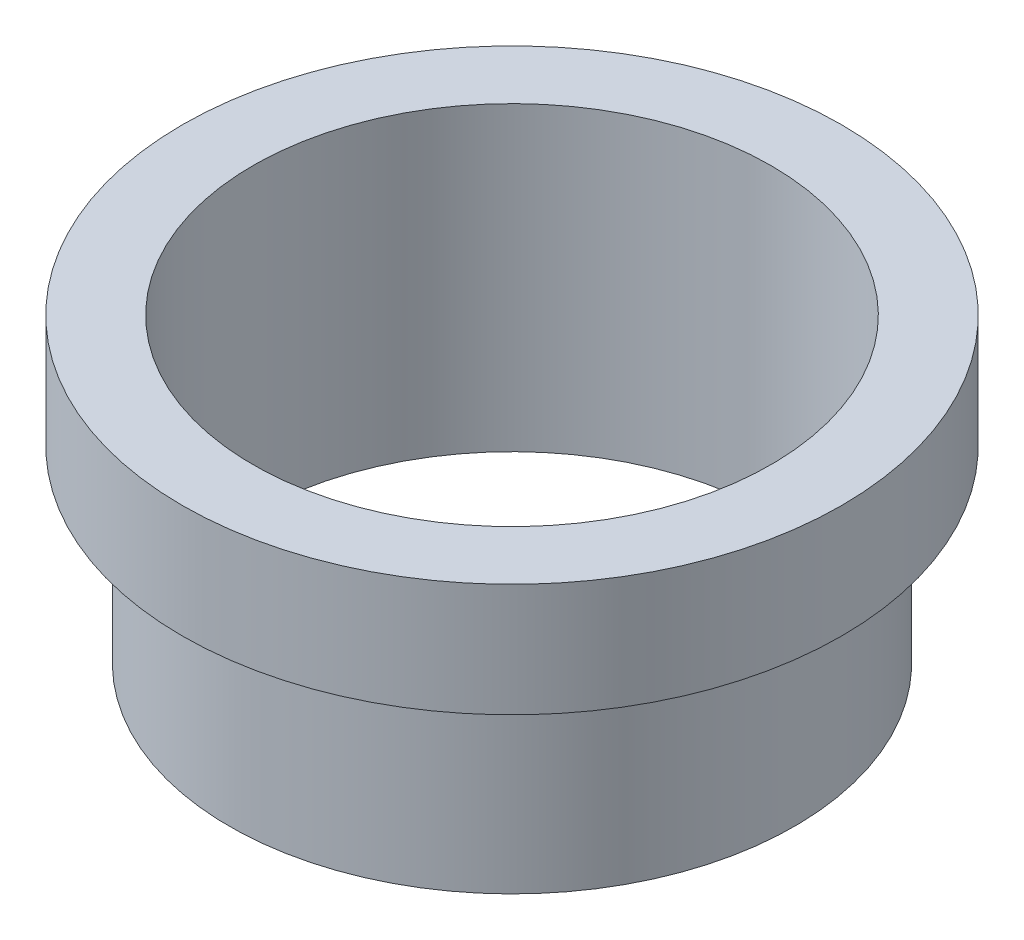
ISO-10303-21;
HEADER;
FILE_DESCRIPTION(('STEP AP214'),'2;1');
FILE_NAME('part.step','',(''),(''),'','','');
FILE_SCHEMA(('AUTOMOTIVE_DESIGN { 1 0 10303 214 1 1 1 1 }'));
ENDSEC;
DATA;
#1=APPLICATION_CONTEXT('core data for automotive mechanical design processes');
#2=APPLICATION_PROTOCOL_DEFINITION('international standard','automotive_design',2000,#1);
#3=PRODUCT_CONTEXT('',#1,'mechanical');
#4=PRODUCT('Part','Part','',(#3));
#5=PRODUCT_RELATED_PRODUCT_CATEGORY('part','',(#4));
#6=PRODUCT_DEFINITION_FORMATION('','',#4);
#7=PRODUCT_DEFINITION_CONTEXT('part definition',#1,'design');
#8=PRODUCT_DEFINITION('design','',#6,#7);
#9=PRODUCT_DEFINITION_SHAPE('','',#8);
#10=(LENGTH_UNIT() NAMED_UNIT(*) SI_UNIT(.MILLI.,.METRE.));
#11=(NAMED_UNIT(*) PLANE_ANGLE_UNIT() SI_UNIT($,.RADIAN.));
#12=(NAMED_UNIT(*) SI_UNIT($,.STERADIAN.) SOLID_ANGLE_UNIT());
#13=UNCERTAINTY_MEASURE_WITH_UNIT(LENGTH_MEASURE(1.E-05),#10,'distance_accuracy_value','');
#14=(GEOMETRIC_REPRESENTATION_CONTEXT(3) GLOBAL_UNCERTAINTY_ASSIGNED_CONTEXT((#13)) GLOBAL_UNIT_ASSIGNED_CONTEXT((#10,
#11,#12)) REPRESENTATION_CONTEXT('',''));
#15=CARTESIAN_POINT('',(0.,0.,0.));
#16=DIRECTION('',(0.,0.,1.));
#17=DIRECTION('',(1.,0.,0.));
#18=AXIS2_PLACEMENT_3D('',#15,#16,#17);
#19=CARTESIAN_POINT('',(-22.225,0.,0.));
#20=DIRECTION('',(0.,-1.,0.));
#21=DIRECTION('',(0.,0.,-1.));
#22=AXIS2_PLACEMENT_3D('',#19,#20,#21);
#23=PLANE('',#22);
#24=CARTESIAN_POINT('',(0.,0.,0.));
#25=DIRECTION('',(0.,-1.,0.));
#26=DIRECTION('',(0.,0.,-1.));
#27=AXIS2_PLACEMENT_3D('',#24,#25,#26);
#28=CIRCLE('',#27,22.225);
#29=CARTESIAN_POINT('',(0.,0.,-22.225));
#30=VERTEX_POINT('',#29);
#31=EDGE_CURVE('E70',#30,#30,#28,.T.);
#32=ORIENTED_EDGE('',*,*,#31,.F.);
#33=EDGE_LOOP('',(#32));
#34=FACE_BOUND('',#33,.T.);
#35=CARTESIAN_POINT('',(0.,0.,0.));
#36=DIRECTION('',(0.,-1.,0.));
#37=DIRECTION('',(0.,0.,-1.));
#38=AXIS2_PLACEMENT_3D('',#35,#36,#37);
#39=CIRCLE('',#38,17.4625);
#40=CARTESIAN_POINT('',(0.,0.,-17.4625));
#41=VERTEX_POINT('',#40);
#42=EDGE_CURVE('E10',#41,#41,#39,.T.);
#43=ORIENTED_EDGE('',*,*,#42,.T.);
#44=EDGE_LOOP('',(#43));
#45=FACE_BOUND('',#44,.T.);
#46=ADVANCED_FACE('F43',(#34,#45),#23,.F.);
#47=CARTESIAN_POINT('',(0.,0.,0.));
#48=DIRECTION('',(0.,-1.,0.));
#49=DIRECTION('',(0.,0.,-1.));
#50=AXIS2_PLACEMENT_3D('',#47,#48,#49);
#51=CYLINDRICAL_SURFACE('',#50,17.4625);
#52=ORIENTED_EDGE('',*,*,#42,.F.);
#53=EDGE_LOOP('',(#52));
#54=FACE_BOUND('',#53,.T.);
#55=CARTESIAN_POINT('',(0.,-20.32,0.));
#56=DIRECTION('',(0.,-1.,0.));
#57=DIRECTION('',(0.,0.,-1.));
#58=AXIS2_PLACEMENT_3D('',#55,#56,#57);
#59=CIRCLE('',#58,17.4625);
#60=CARTESIAN_POINT('',(0.,-20.32,-17.4625));
#61=VERTEX_POINT('',#60);
#62=EDGE_CURVE('E50',#61,#61,#59,.T.);
#63=ORIENTED_EDGE('',*,*,#62,.T.);
#64=EDGE_LOOP('',(#63));
#65=FACE_BOUND('',#64,.T.);
#66=ADVANCED_FACE('F78',(#54,#65),#51,.F.);
#67=CARTESIAN_POINT('',(-17.4625,-20.32,0.));
#68=DIRECTION('',(0.,1.,0.));
#69=DIRECTION('',(0.,0.,1.));
#70=AXIS2_PLACEMENT_3D('',#67,#68,#69);
#71=PLANE('',#70);
#72=ORIENTED_EDGE('',*,*,#62,.F.);
#73=EDGE_LOOP('',(#72));
#74=FACE_BOUND('',#73,.T.);
#75=CARTESIAN_POINT('',(0.,-20.32,0.));
#76=DIRECTION('',(0.,-1.,0.));
#77=DIRECTION('',(0.,0.,-1.));
#78=AXIS2_PLACEMENT_3D('',#75,#76,#77);
#79=CIRCLE('',#78,19.05);
#80=CARTESIAN_POINT('',(0.,-20.32,-19.05));
#81=VERTEX_POINT('',#80);
#82=EDGE_CURVE('E55',#81,#81,#79,.T.);
#83=ORIENTED_EDGE('',*,*,#82,.T.);
#84=EDGE_LOOP('',(#83));
#85=FACE_BOUND('',#84,.T.);
#86=ADVANCED_FACE('F82',(#74,#85),#71,.F.);
#87=CARTESIAN_POINT('',(0.,0.,0.));
#88=DIRECTION('',(0.,-1.,0.));
#89=DIRECTION('',(0.,0.,-1.));
#90=AXIS2_PLACEMENT_3D('',#87,#88,#89);
#91=CYLINDRICAL_SURFACE('',#90,19.05);
#92=ORIENTED_EDGE('',*,*,#82,.F.);
#93=EDGE_LOOP('',(#92));
#94=FACE_BOUND('',#93,.T.);
#95=CARTESIAN_POINT('',(0.,-7.62,0.));
#96=DIRECTION('',(0.,-1.,0.));
#97=DIRECTION('',(0.,0.,-1.));
#98=AXIS2_PLACEMENT_3D('',#95,#96,#97);
#99=CIRCLE('',#98,19.05);
#100=CARTESIAN_POINT('',(0.,-7.62,-19.05));
#101=VERTEX_POINT('',#100);
#102=EDGE_CURVE('E60',#101,#101,#99,.T.);
#103=ORIENTED_EDGE('',*,*,#102,.T.);
#104=EDGE_LOOP('',(#103));
#105=FACE_BOUND('',#104,.T.);
#106=ADVANCED_FACE('F87',(#94,#105),#91,.T.);
#107=CARTESIAN_POINT('',(-19.05,-7.62,0.));
#108=DIRECTION('',(0.,1.,0.));
#109=DIRECTION('',(0.,0.,1.));
#110=AXIS2_PLACEMENT_3D('',#107,#108,#109);
#111=PLANE('',#110);
#112=ORIENTED_EDGE('',*,*,#102,.F.);
#113=EDGE_LOOP('',(#112));
#114=FACE_BOUND('',#113,.T.);
#115=CARTESIAN_POINT('',(0.,-7.62,0.));
#116=DIRECTION('',(0.,-1.,0.));
#117=DIRECTION('',(0.,0.,-1.));
#118=AXIS2_PLACEMENT_3D('',#115,#116,#117);
#119=CIRCLE('',#118,22.225);
#120=CARTESIAN_POINT('',(0.,-7.62,-22.225));
#121=VERTEX_POINT('',#120);
#122=EDGE_CURVE('E66',#121,#121,#119,.T.);
#123=ORIENTED_EDGE('',*,*,#122,.T.);
#124=EDGE_LOOP('',(#123));
#125=FACE_BOUND('',#124,.T.);
#126=ADVANCED_FACE('F93',(#114,#125),#111,.F.);
#127=CARTESIAN_POINT('',(0.,0.,0.));
#128=DIRECTION('',(0.,-1.,0.));
#129=DIRECTION('',(0.,0.,-1.));
#130=AXIS2_PLACEMENT_3D('',#127,#128,#129);
#131=CYLINDRICAL_SURFACE('',#130,22.225);
#132=ORIENTED_EDGE('',*,*,#122,.F.);
#133=EDGE_LOOP('',(#132));
#134=FACE_BOUND('',#133,.T.);
#135=ORIENTED_EDGE('',*,*,#31,.T.);
#136=EDGE_LOOP('',(#135));
#137=FACE_BOUND('',#136,.T.);
#138=ADVANCED_FACE('F75',(#134,#137),#131,.T.);
#139=CLOSED_SHELL('',(#46,#66,#86,#106,#126,#138));
#140=MANIFOLD_SOLID_BREP('B2',#139);
#141=ADVANCED_BREP_SHAPE_REPRESENTATION('',(#18,#140),#14);
#142=SHAPE_DEFINITION_REPRESENTATION(#9,#141);
ENDSEC;
END-ISO-10303-21;
